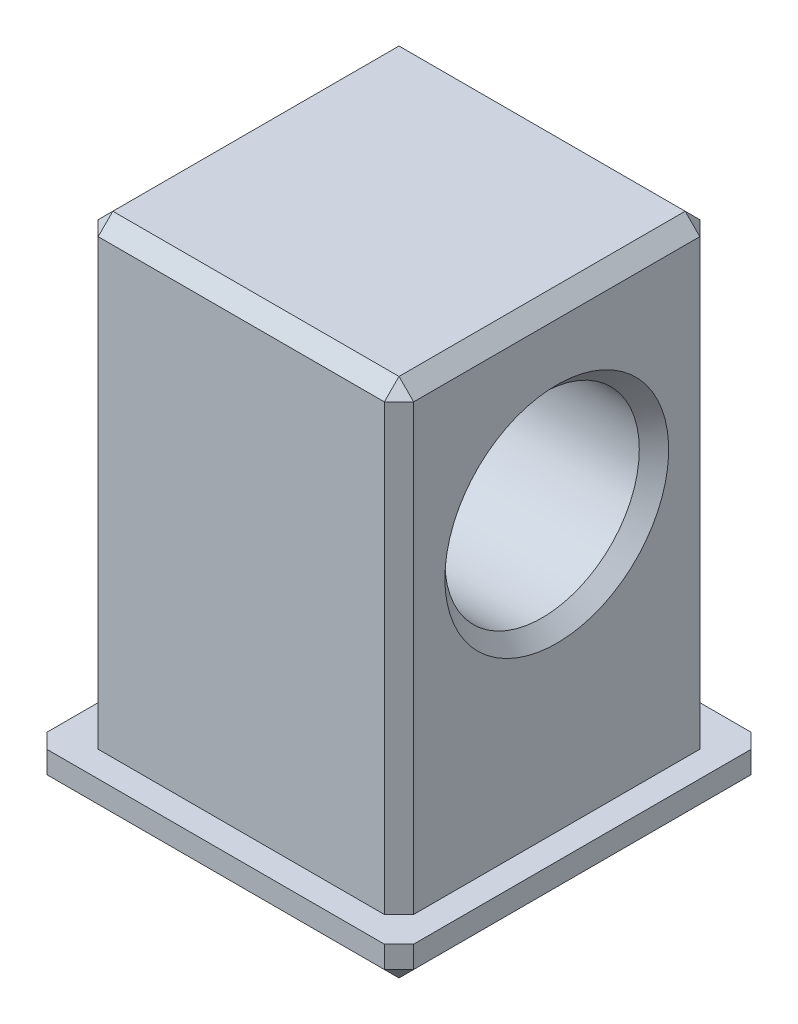
ISO-10303-21;
HEADER;
FILE_DESCRIPTION(('STEP AP214'),'2;1');
FILE_NAME('part.step','',(''),(''),'','','');
FILE_SCHEMA(('AUTOMOTIVE_DESIGN { 1 0 10303 214 1 1 1 1 }'));
ENDSEC;
DATA;
#1=APPLICATION_CONTEXT('core data for automotive mechanical design processes');
#2=APPLICATION_PROTOCOL_DEFINITION('international standard','automotive_design',2000,#1);
#3=PRODUCT_CONTEXT('',#1,'mechanical');
#4=PRODUCT('Part','Part','',(#3));
#5=PRODUCT_RELATED_PRODUCT_CATEGORY('part','',(#4));
#6=PRODUCT_DEFINITION_FORMATION('','',#4);
#7=PRODUCT_DEFINITION_CONTEXT('part definition',#1,'design');
#8=PRODUCT_DEFINITION('design','',#6,#7);
#9=PRODUCT_DEFINITION_SHAPE('','',#8);
#10=(LENGTH_UNIT() NAMED_UNIT(*) SI_UNIT(.MILLI.,.METRE.));
#11=(NAMED_UNIT(*) PLANE_ANGLE_UNIT() SI_UNIT($,.RADIAN.));
#12=(NAMED_UNIT(*) SI_UNIT($,.STERADIAN.) SOLID_ANGLE_UNIT());
#13=UNCERTAINTY_MEASURE_WITH_UNIT(LENGTH_MEASURE(1.E-05),#10,'distance_accuracy_value','');
#14=(GEOMETRIC_REPRESENTATION_CONTEXT(3) GLOBAL_UNCERTAINTY_ASSIGNED_CONTEXT((#13)) GLOBAL_UNIT_ASSIGNED_CONTEXT((#10,
#11,#12)) REPRESENTATION_CONTEXT('',''));
#15=CARTESIAN_POINT('',(0.,0.,0.));
#16=DIRECTION('',(0.,0.,1.));
#17=DIRECTION('',(1.,0.,0.));
#18=AXIS2_PLACEMENT_3D('',#15,#16,#17);
#19=CARTESIAN_POINT('',(0.,2.54,0.));
#20=DIRECTION('',(0.,-1.,0.));
#21=DIRECTION('',(0.,0.,-1.));
#22=AXIS2_PLACEMENT_3D('',#19,#20,#21);
#23=PLANE('',#22);
#24=DIRECTION('',(0.,0.,-1.));
#25=VECTOR('',#24,1.);
#26=CARTESIAN_POINT('',(25.4,2.54,0.));
#27=LINE('',#26,#25);
#28=CARTESIAN_POINT('',(25.4,2.54,-1.01600000000002));
#29=VERTEX_POINT('',#28);
#30=CARTESIAN_POINT('',(25.4,2.54,-24.384));
#31=VERTEX_POINT('',#30);
#32=EDGE_CURVE('E220',#29,#31,#27,.T.);
#33=ORIENTED_EDGE('',*,*,#32,.T.);
#34=DIRECTION('',(0.707106781186545,0.,0.70710678118655));
#35=VECTOR('',#34,1.);
#36=CARTESIAN_POINT('',(24.384,2.54,-25.4));
#37=LINE('',#36,#35);
#38=CARTESIAN_POINT('',(24.384,2.54,-25.4));
#39=VERTEX_POINT('',#38);
#40=EDGE_CURVE('E285',#31,#39,#37,.F.);
#41=ORIENTED_EDGE('',*,*,#40,.T.);
#42=DIRECTION('',(-1.,0.,0.));
#43=VECTOR('',#42,1.);
#44=CARTESIAN_POINT('',(0.,2.54,-25.4));
#45=LINE('',#44,#43);
#46=CARTESIAN_POINT('',(1.01600000000001,2.54,-25.4));
#47=VERTEX_POINT('',#46);
#48=EDGE_CURVE('E223',#39,#47,#45,.T.);
#49=ORIENTED_EDGE('',*,*,#48,.T.);
#50=DIRECTION('',(0.707106781186545,0.,-0.70710678118655));
#51=VECTOR('',#50,1.);
#52=CARTESIAN_POINT('',(0.,2.54,-24.384));
#53=LINE('',#52,#51);
#54=CARTESIAN_POINT('',(0.,2.54,-24.384));
#55=VERTEX_POINT('',#54);
#56=EDGE_CURVE('E281',#47,#55,#53,.F.);
#57=ORIENTED_EDGE('',*,*,#56,.T.);
#58=DIRECTION('',(0.,0.,1.));
#59=VECTOR('',#58,1.);
#60=CARTESIAN_POINT('',(0.,2.54,0.));
#61=LINE('',#60,#59);
#62=CARTESIAN_POINT('',(0.,2.54,-1.01600000000002));
#63=VERTEX_POINT('',#62);
#64=EDGE_CURVE('E214',#55,#63,#61,.T.);
#65=ORIENTED_EDGE('',*,*,#64,.T.);
#66=DIRECTION('',(-0.707106781186545,0.,-0.70710678118655));
#67=VECTOR('',#66,1.);
#68=CARTESIAN_POINT('',(1.01600000000001,2.54,0.));
#69=LINE('',#68,#67);
#70=CARTESIAN_POINT('',(1.01600000000001,2.54,0.));
#71=VERTEX_POINT('',#70);
#72=EDGE_CURVE('E279',#63,#71,#69,.F.);
#73=ORIENTED_EDGE('',*,*,#72,.T.);
#74=DIRECTION('',(1.,0.,0.));
#75=VECTOR('',#74,1.);
#76=CARTESIAN_POINT('',(0.,2.54,0.));
#77=LINE('',#76,#75);
#78=CARTESIAN_POINT('',(24.384,2.54,0.));
#79=VERTEX_POINT('',#78);
#80=EDGE_CURVE('E217',#71,#79,#77,.T.);
#81=ORIENTED_EDGE('',*,*,#80,.T.);
#82=DIRECTION('',(-0.707106781186545,0.,0.70710678118655));
#83=VECTOR('',#82,1.);
#84=CARTESIAN_POINT('',(25.4,2.54,-1.01600000000002));
#85=LINE('',#84,#83);
#86=EDGE_CURVE('E283',#79,#29,#85,.F.);
#87=ORIENTED_EDGE('',*,*,#86,.T.);
#88=EDGE_LOOP('',(#33,#41,#49,#57,#65,#73,#81,#87));
#89=FACE_BOUND('',#88,.T.);
#90=DIRECTION('',(0.,0.,1.));
#91=VECTOR('',#90,1.);
#92=CARTESIAN_POINT('',(1.778,2.54,-1.778));
#93=LINE('',#92,#91);
#94=CARTESIAN_POINT('',(1.778,2.54,-22.606));
#95=VERTEX_POINT('',#94);
#96=CARTESIAN_POINT('',(1.778,2.54,-2.794));
#97=VERTEX_POINT('',#96);
#98=EDGE_CURVE('E191',#95,#97,#93,.T.);
#99=ORIENTED_EDGE('',*,*,#98,.F.);
#100=DIRECTION('',(-0.707106781186545,0.,0.70710678118655));
#101=VECTOR('',#100,1.);
#102=CARTESIAN_POINT('',(-10.414,2.54,-10.4139999999999));
#103=LINE('',#102,#101);
#104=CARTESIAN_POINT('',(2.79399999999999,2.54,-23.622));
#105=VERTEX_POINT('',#104);
#106=EDGE_CURVE('E176',#95,#105,#103,.F.);
#107=ORIENTED_EDGE('',*,*,#106,.T.);
#108=DIRECTION('',(-1.,0.,0.));
#109=VECTOR('',#108,1.);
#110=CARTESIAN_POINT('',(1.778,2.54,-23.622));
#111=LINE('',#110,#109);
#112=CARTESIAN_POINT('',(22.606,2.54,-23.622));
#113=VERTEX_POINT('',#112);
#114=EDGE_CURVE('E212',#113,#105,#111,.T.);
#115=ORIENTED_EDGE('',*,*,#114,.F.);
#116=DIRECTION('',(-0.707106781186544,0.,-0.707106781186551));
#117=VECTOR('',#116,1.);
#118=CARTESIAN_POINT('',(23.1140000000001,2.54,-23.1139999999999));
#119=LINE('',#118,#117);
#120=CARTESIAN_POINT('',(23.622,2.54,-22.606));
#121=VERTEX_POINT('',#120);
#122=EDGE_CURVE('E11',#113,#121,#119,.F.);
#123=ORIENTED_EDGE('',*,*,#122,.T.);
#124=DIRECTION('',(0.,0.,-1.));
#125=VECTOR('',#124,1.);
#126=CARTESIAN_POINT('',(23.622,2.54,-1.778));
#127=LINE('',#126,#125);
#128=CARTESIAN_POINT('',(23.622,2.54,-2.794));
#129=VERTEX_POINT('',#128);
#130=EDGE_CURVE('E204',#129,#121,#127,.T.);
#131=ORIENTED_EDGE('',*,*,#130,.F.);
#132=DIRECTION('',(0.707106781186545,0.,-0.70710678118655));
#133=VECTOR('',#132,1.);
#134=CARTESIAN_POINT('',(10.4140000000001,2.54,10.414));
#135=LINE('',#134,#133);
#136=CARTESIAN_POINT('',(22.606,2.54,-1.778));
#137=VERTEX_POINT('',#136);
#138=EDGE_CURVE('E48',#129,#137,#135,.F.);
#139=ORIENTED_EDGE('',*,*,#138,.T.);
#140=DIRECTION('',(1.,0.,0.));
#141=VECTOR('',#140,1.);
#142=CARTESIAN_POINT('',(1.778,2.54,-1.778));
#143=LINE('',#142,#141);
#144=CARTESIAN_POINT('',(2.79399999999999,2.54,-1.778));
#145=VERTEX_POINT('',#144);
#146=EDGE_CURVE('E200',#145,#137,#143,.T.);
#147=ORIENTED_EDGE('',*,*,#146,.F.);
#148=DIRECTION('',(0.707106781186545,0.,0.70710678118655));
#149=VECTOR('',#148,1.);
#150=CARTESIAN_POINT('',(2.286,2.54,-2.28599999999999));
#151=LINE('',#150,#149);
#152=EDGE_CURVE('E186',#145,#97,#151,.F.);
#153=ORIENTED_EDGE('',*,*,#152,.T.);
#154=EDGE_LOOP('',(#99,#107,#115,#123,#131,#139,#147,#153));
#155=FACE_BOUND('',#154,.T.);
#156=ADVANCED_FACE('F38',(#89,#155),#23,.F.);
#157=CARTESIAN_POINT('',(0.,2.54,0.));
#158=DIRECTION('',(1.,0.,0.));
#159=DIRECTION('',(0.,0.,-1.));
#160=AXIS2_PLACEMENT_3D('',#157,#158,#159);
#161=PLANE('',#160);
#162=ORIENTED_EDGE('',*,*,#64,.F.);
#163=DIRECTION('',(0.,-1.,0.));
#164=VECTOR('',#163,1.);
#165=CARTESIAN_POINT('',(0.,2.54,-24.384));
#166=LINE('',#165,#164);
#167=CARTESIAN_POINT('',(0.,1.01600000000002,-24.384));
#168=VERTEX_POINT('',#167);
#169=EDGE_CURVE('E56',#55,#168,#166,.T.);
#170=ORIENTED_EDGE('',*,*,#169,.T.);
#171=DIRECTION('',(0.,0.,1.));
#172=VECTOR('',#171,1.);
#173=CARTESIAN_POINT('',(0.,1.01600000000002,0.));
#174=LINE('',#173,#172);
#175=CARTESIAN_POINT('',(0.,1.01600000000002,-1.01600000000002));
#176=VERTEX_POINT('',#175);
#177=EDGE_CURVE('E60',#168,#176,#174,.T.);
#178=ORIENTED_EDGE('',*,*,#177,.T.);
#179=DIRECTION('',(0.,1.,0.));
#180=VECTOR('',#179,1.);
#181=CARTESIAN_POINT('',(0.,2.54,-1.01600000000002));
#182=LINE('',#181,#180);
#183=EDGE_CURVE('E302',#176,#63,#182,.T.);
#184=ORIENTED_EDGE('',*,*,#183,.T.);
#185=EDGE_LOOP('',(#162,#170,#178,#184));
#186=FACE_BOUND('',#185,.T.);
#187=ADVANCED_FACE('F379',(#186),#161,.F.);
#188=CARTESIAN_POINT('',(0.,2.54,0.));
#189=DIRECTION('',(0.,0.,-1.));
#190=DIRECTION('',(-1.,0.,0.));
#191=AXIS2_PLACEMENT_3D('',#188,#189,#190);
#192=PLANE('',#191);
#193=DIRECTION('',(1.,0.,0.));
#194=VECTOR('',#193,1.);
#195=CARTESIAN_POINT('',(25.4,1.01600000000001,0.));
#196=LINE('',#195,#194);
#197=CARTESIAN_POINT('',(1.01600000000001,1.01600000000001,0.));
#198=VERTEX_POINT('',#197);
#199=CARTESIAN_POINT('',(24.384,1.01600000000001,0.));
#200=VERTEX_POINT('',#199);
#201=EDGE_CURVE('E289',#198,#200,#196,.T.);
#202=ORIENTED_EDGE('',*,*,#201,.T.);
#203=DIRECTION('',(0.,1.,0.));
#204=VECTOR('',#203,1.);
#205=CARTESIAN_POINT('',(24.384,2.54,0.));
#206=LINE('',#205,#204);
#207=EDGE_CURVE('E291',#200,#79,#206,.T.);
#208=ORIENTED_EDGE('',*,*,#207,.T.);
#209=ORIENTED_EDGE('',*,*,#80,.F.);
#210=DIRECTION('',(0.,-1.,0.));
#211=VECTOR('',#210,1.);
#212=CARTESIAN_POINT('',(1.01600000000001,2.54,0.));
#213=LINE('',#212,#211);
#214=EDGE_CURVE('E287',#71,#198,#213,.T.);
#215=ORIENTED_EDGE('',*,*,#214,.T.);
#216=EDGE_LOOP('',(#202,#208,#209,#215));
#217=FACE_BOUND('',#216,.T.);
#218=ADVANCED_FACE('F420',(#217),#192,.F.);
#219=CARTESIAN_POINT('',(25.4,2.54,0.));
#220=DIRECTION('',(-1.,0.,0.));
#221=DIRECTION('',(0.,0.,1.));
#222=AXIS2_PLACEMENT_3D('',#219,#220,#221);
#223=PLANE('',#222);
#224=DIRECTION('',(0.,0.,-1.));
#225=VECTOR('',#224,1.);
#226=CARTESIAN_POINT('',(25.4,1.01600000000001,-25.4));
#227=LINE('',#226,#225);
#228=CARTESIAN_POINT('',(25.4,1.01600000000001,-1.01600000000002));
#229=VERTEX_POINT('',#228);
#230=CARTESIAN_POINT('',(25.4,1.01600000000001,-24.384));
#231=VERTEX_POINT('',#230);
#232=EDGE_CURVE('E273',#229,#231,#227,.T.);
#233=ORIENTED_EDGE('',*,*,#232,.T.);
#234=DIRECTION('',(0.,1.,0.));
#235=VECTOR('',#234,1.);
#236=CARTESIAN_POINT('',(25.4,2.54,-24.384));
#237=LINE('',#236,#235);
#238=EDGE_CURVE('E277',#231,#31,#237,.T.);
#239=ORIENTED_EDGE('',*,*,#238,.T.);
#240=ORIENTED_EDGE('',*,*,#32,.F.);
#241=DIRECTION('',(0.,-1.,0.));
#242=VECTOR('',#241,1.);
#243=CARTESIAN_POINT('',(25.4,2.54,-1.01600000000002));
#244=LINE('',#243,#242);
#245=EDGE_CURVE('E275',#29,#229,#244,.T.);
#246=ORIENTED_EDGE('',*,*,#245,.T.);
#247=EDGE_LOOP('',(#233,#239,#240,#246));
#248=FACE_BOUND('',#247,.T.);
#249=ADVANCED_FACE('F412',(#248),#223,.F.);
#250=CARTESIAN_POINT('',(0.,2.54,-25.4));
#251=DIRECTION('',(0.,0.,1.));
#252=DIRECTION('',(1.,0.,0.));
#253=AXIS2_PLACEMENT_3D('',#250,#251,#252);
#254=PLANE('',#253);
#255=ORIENTED_EDGE('',*,*,#48,.F.);
#256=DIRECTION('',(0.,-1.,0.));
#257=VECTOR('',#256,1.);
#258=CARTESIAN_POINT('',(24.384,2.54,-25.4));
#259=LINE('',#258,#257);
#260=CARTESIAN_POINT('',(24.384,1.01600000000001,-25.4));
#261=VERTEX_POINT('',#260);
#262=EDGE_CURVE('E270',#39,#261,#259,.T.);
#263=ORIENTED_EDGE('',*,*,#262,.T.);
#264=DIRECTION('',(-1.,0.,0.));
#265=VECTOR('',#264,1.);
#266=CARTESIAN_POINT('',(0.,1.01600000000001,-25.4));
#267=LINE('',#266,#265);
#268=CARTESIAN_POINT('',(1.01600000000001,1.01600000000001,-25.4));
#269=VERTEX_POINT('',#268);
#270=EDGE_CURVE('E266',#261,#269,#267,.T.);
#271=ORIENTED_EDGE('',*,*,#270,.T.);
#272=DIRECTION('',(0.,1.,0.));
#273=VECTOR('',#272,1.);
#274=CARTESIAN_POINT('',(1.01600000000001,2.54,-25.4));
#275=LINE('',#274,#273);
#276=EDGE_CURVE('E268',#269,#47,#275,.T.);
#277=ORIENTED_EDGE('',*,*,#276,.T.);
#278=EDGE_LOOP('',(#255,#263,#271,#277));
#279=FACE_BOUND('',#278,.T.);
#280=ADVANCED_FACE('F427',(#279),#254,.F.);
#281=CARTESIAN_POINT('',(0.,0.,0.));
#282=DIRECTION('',(0.,-1.,0.));
#283=DIRECTION('',(0.,0.,-1.));
#284=AXIS2_PLACEMENT_3D('',#281,#282,#283);
#285=PLANE('',#284);
#286=DIRECTION('',(0.,0.,1.));
#287=VECTOR('',#286,1.);
#288=CARTESIAN_POINT('',(24.384,0.,0.));
#289=LINE('',#288,#287);
#290=CARTESIAN_POINT('',(24.384,0.,-24.384));
#291=VERTEX_POINT('',#290);
#292=CARTESIAN_POINT('',(24.384,0.,-1.01600000000002));
#293=VERTEX_POINT('',#292);
#294=EDGE_CURVE('E297',#291,#293,#289,.T.);
#295=ORIENTED_EDGE('',*,*,#294,.T.);
#296=DIRECTION('',(-1.,0.,0.));
#297=VECTOR('',#296,1.);
#298=CARTESIAN_POINT('',(0.,0.,-1.01600000000002));
#299=LINE('',#298,#297);
#300=CARTESIAN_POINT('',(1.01600000000001,0.,-1.01600000000002));
#301=VERTEX_POINT('',#300);
#302=EDGE_CURVE('E299',#293,#301,#299,.T.);
#303=ORIENTED_EDGE('',*,*,#302,.T.);
#304=DIRECTION('',(0.,0.,-1.));
#305=VECTOR('',#304,1.);
#306=CARTESIAN_POINT('',(1.01600000000001,0.,-25.4));
#307=LINE('',#306,#305);
#308=CARTESIAN_POINT('',(1.01600000000001,0.,-24.384));
#309=VERTEX_POINT('',#308);
#310=EDGE_CURVE('E293',#301,#309,#307,.T.);
#311=ORIENTED_EDGE('',*,*,#310,.T.);
#312=DIRECTION('',(1.,0.,0.));
#313=VECTOR('',#312,1.);
#314=CARTESIAN_POINT('',(25.4,0.,-24.384));
#315=LINE('',#314,#313);
#316=EDGE_CURVE('E295',#309,#291,#315,.T.);
#317=ORIENTED_EDGE('',*,*,#316,.T.);
#318=EDGE_LOOP('',(#295,#303,#311,#317));
#319=FACE_BOUND('',#318,.T.);
#320=ADVANCED_FACE('F395',(#319),#285,.T.);
#321=CARTESIAN_POINT('',(1.778,34.29,-1.778));
#322=DIRECTION('',(1.,0.,0.));
#323=DIRECTION('',(0.,0.,-1.));
#324=AXIS2_PLACEMENT_3D('',#321,#322,#323);
#325=PLANE('',#324);
#326=CARTESIAN_POINT('',(1.778,21.59,-12.7));
#327=DIRECTION('',(1.,0.,0.));
#328=DIRECTION('',(0.,0.,-1.));
#329=AXIS2_PLACEMENT_3D('',#326,#327,#328);
#330=CIRCLE('',#329,7.74700000000001);
#331=CARTESIAN_POINT('',(1.778,21.59,-20.447));
#332=VERTEX_POINT('',#331);
#333=EDGE_CURVE('E196',#332,#332,#330,.T.);
#334=ORIENTED_EDGE('',*,*,#333,.T.);
#335=EDGE_LOOP('',(#334));
#336=FACE_BOUND('',#335,.T.);
#337=DIRECTION('',(0.,0.,-1.));
#338=VECTOR('',#337,1.);
#339=CARTESIAN_POINT('',(1.778,33.274,-1.778));
#340=LINE('',#339,#338);
#341=CARTESIAN_POINT('',(1.778,33.274,-2.794));
#342=VERTEX_POINT('',#341);
#343=CARTESIAN_POINT('',(1.778,33.274,-22.606));
#344=VERTEX_POINT('',#343);
#345=EDGE_CURVE('E194',#342,#344,#340,.T.);
#346=ORIENTED_EDGE('',*,*,#345,.T.);
#347=DIRECTION('',(0.,-1.,0.));
#348=VECTOR('',#347,1.);
#349=CARTESIAN_POINT('',(1.778,34.29,-22.606));
#350=LINE('',#349,#348);
#351=EDGE_CURVE('E180',#344,#95,#350,.T.);
#352=ORIENTED_EDGE('',*,*,#351,.T.);
#353=ORIENTED_EDGE('',*,*,#98,.T.);
#354=DIRECTION('',(0.,1.,0.));
#355=VECTOR('',#354,1.);
#356=CARTESIAN_POINT('',(1.778,34.29,-2.794));
#357=LINE('',#356,#355);
#358=EDGE_CURVE('E232',#97,#342,#357,.T.);
#359=ORIENTED_EDGE('',*,*,#358,.T.);
#360=EDGE_LOOP('',(#346,#352,#353,#359));
#361=FACE_BOUND('',#360,.T.);
#362=ADVANCED_FACE('F190',(#336,#361),#325,.F.);
#363=CARTESIAN_POINT('',(1.778,34.29,-1.778));
#364=DIRECTION('',(0.,0.,-1.));
#365=DIRECTION('',(-1.,0.,0.));
#366=AXIS2_PLACEMENT_3D('',#363,#364,#365);
#367=PLANE('',#366);
#368=DIRECTION('',(-1.,0.,0.));
#369=VECTOR('',#368,1.);
#370=CARTESIAN_POINT('',(1.778,33.274,-1.778));
#371=LINE('',#370,#369);
#372=CARTESIAN_POINT('',(22.606,33.274,-1.778));
#373=VERTEX_POINT('',#372);
#374=CARTESIAN_POINT('',(2.79399999999999,33.274,-1.778));
#375=VERTEX_POINT('',#374);
#376=EDGE_CURVE('E262',#373,#375,#371,.T.);
#377=ORIENTED_EDGE('',*,*,#376,.T.);
#378=DIRECTION('',(0.,-1.,0.));
#379=VECTOR('',#378,1.);
#380=CARTESIAN_POINT('',(2.79399999999999,34.29,-1.778));
#381=LINE('',#380,#379);
#382=EDGE_CURVE('E264',#375,#145,#381,.T.);
#383=ORIENTED_EDGE('',*,*,#382,.T.);
#384=ORIENTED_EDGE('',*,*,#146,.T.);
#385=DIRECTION('',(0.,1.,0.));
#386=VECTOR('',#385,1.);
#387=CARTESIAN_POINT('',(22.606,34.29,-1.778));
#388=LINE('',#387,#386);
#389=EDGE_CURVE('E260',#137,#373,#388,.T.);
#390=ORIENTED_EDGE('',*,*,#389,.T.);
#391=EDGE_LOOP('',(#377,#383,#384,#390));
#392=FACE_BOUND('',#391,.T.);
#393=ADVANCED_FACE('F689',(#392),#367,.F.);
#394=CARTESIAN_POINT('',(23.622,34.29,-1.778));
#395=DIRECTION('',(-1.,0.,0.));
#396=DIRECTION('',(0.,0.,1.));
#397=AXIS2_PLACEMENT_3D('',#394,#395,#396);
#398=PLANE('',#397);
#399=CARTESIAN_POINT('',(23.622,21.59,-12.7));
#400=DIRECTION('',(-1.,0.,0.));
#401=DIRECTION('',(0.,0.,1.));
#402=AXIS2_PLACEMENT_3D('',#399,#400,#401);
#403=CIRCLE('',#402,7.74700000000001);
#404=CARTESIAN_POINT('',(23.622,21.59,-4.95299999999999));
#405=VERTEX_POINT('',#404);
#406=EDGE_CURVE('E243',#405,#405,#403,.T.);
#407=ORIENTED_EDGE('',*,*,#406,.T.);
#408=EDGE_LOOP('',(#407));
#409=FACE_BOUND('',#408,.T.);
#410=DIRECTION('',(0.,0.,1.));
#411=VECTOR('',#410,1.);
#412=CARTESIAN_POINT('',(23.622,33.274,-1.778));
#413=LINE('',#412,#411);
#414=CARTESIAN_POINT('',(23.622,33.274,-22.606));
#415=VERTEX_POINT('',#414);
#416=CARTESIAN_POINT('',(23.622,33.274,-2.794));
#417=VERTEX_POINT('',#416);
#418=EDGE_CURVE('E239',#415,#417,#413,.T.);
#419=ORIENTED_EDGE('',*,*,#418,.T.);
#420=DIRECTION('',(0.,-1.,0.));
#421=VECTOR('',#420,1.);
#422=CARTESIAN_POINT('',(23.622,34.29,-2.794));
#423=LINE('',#422,#421);
#424=EDGE_CURVE('E241',#417,#129,#423,.T.);
#425=ORIENTED_EDGE('',*,*,#424,.T.);
#426=ORIENTED_EDGE('',*,*,#130,.T.);
#427=DIRECTION('',(0.,1.,0.));
#428=VECTOR('',#427,1.);
#429=CARTESIAN_POINT('',(23.622,34.29,-22.606));
#430=LINE('',#429,#428);
#431=EDGE_CURVE('E237',#121,#415,#430,.T.);
#432=ORIENTED_EDGE('',*,*,#431,.T.);
#433=EDGE_LOOP('',(#419,#425,#426,#432));
#434=FACE_BOUND('',#433,.T.);
#435=ADVANCED_FACE('F681',(#409,#434),#398,.F.);
#436=CARTESIAN_POINT('',(1.778,34.29,-23.622));
#437=DIRECTION('',(0.,0.,1.));
#438=DIRECTION('',(1.,0.,0.));
#439=AXIS2_PLACEMENT_3D('',#436,#437,#438);
#440=PLANE('',#439);
#441=ORIENTED_EDGE('',*,*,#114,.T.);
#442=DIRECTION('',(0.,1.,0.));
#443=VECTOR('',#442,1.);
#444=CARTESIAN_POINT('',(2.79399999999999,34.29,-23.622));
#445=LINE('',#444,#443);
#446=CARTESIAN_POINT('',(2.79399999999999,33.274,-23.622));
#447=VERTEX_POINT('',#446);
#448=EDGE_CURVE('E181',#105,#447,#445,.T.);
#449=ORIENTED_EDGE('',*,*,#448,.T.);
#450=DIRECTION('',(1.,0.,0.));
#451=VECTOR('',#450,1.);
#452=CARTESIAN_POINT('',(1.778,33.274,-23.622));
#453=LINE('',#452,#451);
#454=CARTESIAN_POINT('',(22.606,33.274,-23.622));
#455=VERTEX_POINT('',#454);
#456=EDGE_CURVE('E248',#447,#455,#453,.T.);
#457=ORIENTED_EDGE('',*,*,#456,.T.);
#458=DIRECTION('',(0.,-1.,0.));
#459=VECTOR('',#458,1.);
#460=CARTESIAN_POINT('',(22.606,34.29,-23.622));
#461=LINE('',#460,#459);
#462=EDGE_CURVE('E246',#455,#113,#461,.T.);
#463=ORIENTED_EDGE('',*,*,#462,.T.);
#464=EDGE_LOOP('',(#441,#449,#457,#463));
#465=FACE_BOUND('',#464,.T.);
#466=ADVANCED_FACE('F673',(#465),#440,.F.);
#467=CARTESIAN_POINT('',(0.,34.29,0.));
#468=DIRECTION('',(0.,-1.,0.));
#469=DIRECTION('',(0.,0.,-1.));
#470=AXIS2_PLACEMENT_3D('',#467,#468,#469);
#471=PLANE('',#470);
#472=DIRECTION('',(0.,0.,-1.));
#473=VECTOR('',#472,1.);
#474=CARTESIAN_POINT('',(22.606,34.29,0.));
#475=LINE('',#474,#473);
#476=CARTESIAN_POINT('',(22.606,34.29,-2.794));
#477=VERTEX_POINT('',#476);
#478=CARTESIAN_POINT('',(22.606,34.29,-22.606));
#479=VERTEX_POINT('',#478);
#480=EDGE_CURVE('E251',#477,#479,#475,.T.);
#481=ORIENTED_EDGE('',*,*,#480,.T.);
#482=DIRECTION('',(-1.,0.,0.));
#483=VECTOR('',#482,1.);
#484=CARTESIAN_POINT('',(0.,34.29,-22.606));
#485=LINE('',#484,#483);
#486=CARTESIAN_POINT('',(2.79399999999999,34.29,-22.606));
#487=VERTEX_POINT('',#486);
#488=EDGE_CURVE('E257',#479,#487,#485,.T.);
#489=ORIENTED_EDGE('',*,*,#488,.T.);
#490=DIRECTION('',(0.,0.,1.));
#491=VECTOR('',#490,1.);
#492=CARTESIAN_POINT('',(2.79399999999999,34.29,0.));
#493=LINE('',#492,#491);
#494=CARTESIAN_POINT('',(2.79399999999999,34.29,-2.79399999999999));
#495=VERTEX_POINT('',#494);
#496=EDGE_CURVE('E255',#487,#495,#493,.T.);
#497=ORIENTED_EDGE('',*,*,#496,.T.);
#498=DIRECTION('',(1.,0.,0.));
#499=VECTOR('',#498,1.);
#500=CARTESIAN_POINT('',(0.,34.29,-2.79399999999999));
#501=LINE('',#500,#499);
#502=EDGE_CURVE('E253',#495,#477,#501,.T.);
#503=ORIENTED_EDGE('',*,*,#502,.T.);
#504=EDGE_LOOP('',(#481,#489,#497,#503));
#505=FACE_BOUND('',#504,.T.);
#506=ADVANCED_FACE('F665',(#505),#471,.F.);
#507=CARTESIAN_POINT('',(25.4,21.59,-12.7));
#508=DIRECTION('',(-1.,0.,0.));
#509=DIRECTION('',(0.,0.,1.));
#510=AXIS2_PLACEMENT_3D('',#507,#508,#509);
#511=CYLINDRICAL_SURFACE('',#510,6.731);
#512=CARTESIAN_POINT('',(2.794,21.59,-12.7));
#513=DIRECTION('',(1.,0.,0.));
#514=DIRECTION('',(0.,0.,-1.));
#515=AXIS2_PLACEMENT_3D('',#512,#513,#514);
#516=CIRCLE('',#515,6.731);
#517=CARTESIAN_POINT('',(2.794,21.59,-19.431));
#518=VERTEX_POINT('',#517);
#519=EDGE_CURVE('E229',#518,#518,#516,.F.);
#520=ORIENTED_EDGE('',*,*,#519,.T.);
#521=EDGE_LOOP('',(#520));
#522=FACE_BOUND('',#521,.T.);
#523=CARTESIAN_POINT('',(22.606,21.59,-12.7));
#524=DIRECTION('',(-1.,0.,0.));
#525=DIRECTION('',(0.,0.,1.));
#526=AXIS2_PLACEMENT_3D('',#523,#524,#525);
#527=CIRCLE('',#526,6.731);
#528=CARTESIAN_POINT('',(22.606,21.59,-5.969));
#529=VERTEX_POINT('',#528);
#530=EDGE_CURVE('E226',#529,#529,#527,.F.);
#531=ORIENTED_EDGE('',*,*,#530,.T.);
#532=EDGE_LOOP('',(#531));
#533=FACE_BOUND('',#532,.T.);
#534=ADVANCED_FACE('F467',(#522,#533),#511,.F.);
#535=CARTESIAN_POINT('',(2.794,21.59,-12.7));
#536=DIRECTION('',(-1.,0.,0.));
#537=DIRECTION('',(0.,0.,1.));
#538=AXIS2_PLACEMENT_3D('',#535,#536,#537);
#539=CONICAL_SURFACE('',#538,6.731,0.785398163397448);
#540=ORIENTED_EDGE('',*,*,#333,.F.);
#541=EDGE_LOOP('',(#540));
#542=FACE_BOUND('',#541,.T.);
#543=ORIENTED_EDGE('',*,*,#519,.F.);
#544=EDGE_LOOP('',(#543));
#545=FACE_BOUND('',#544,.T.);
#546=ADVANCED_FACE('F460',(#542,#545),#539,.F.);
#547=CARTESIAN_POINT('',(23.622,21.59,-12.7));
#548=DIRECTION('',(1.,0.,0.));
#549=DIRECTION('',(0.,0.,-1.));
#550=AXIS2_PLACEMENT_3D('',#547,#548,#549);
#551=CONICAL_SURFACE('',#550,7.747,0.785398163397445);
#552=ORIENTED_EDGE('',*,*,#530,.F.);
#553=EDGE_LOOP('',(#552));
#554=FACE_BOUND('',#553,.T.);
#555=ORIENTED_EDGE('',*,*,#406,.F.);
#556=EDGE_LOOP('',(#555));
#557=FACE_BOUND('',#556,.T.);
#558=ADVANCED_FACE('F466',(#554,#557),#551,.F.);
#559=CARTESIAN_POINT('',(23.622,34.29,-2.794));
#560=DIRECTION('',(-0.70710678118655,0.,-0.707106781186545));
#561=DIRECTION('',(0.,-1.,0.));
#562=AXIS2_PLACEMENT_3D('',#559,#560,#561);
#563=PLANE('',#562);
#564=DIRECTION('',(-0.707106781186545,0.,0.70710678118655));
#565=VECTOR('',#564,1.);
#566=CARTESIAN_POINT('',(23.114,33.274,-2.286));
#567=LINE('',#566,#565);
#568=EDGE_CURVE('E201',#373,#417,#567,.F.);
#569=ORIENTED_EDGE('',*,*,#568,.F.);
#570=ORIENTED_EDGE('',*,*,#389,.F.);
#571=ORIENTED_EDGE('',*,*,#138,.F.);
#572=ORIENTED_EDGE('',*,*,#424,.F.);
#573=EDGE_LOOP('',(#569,#570,#571,#572));
#574=FACE_BOUND('',#573,.T.);
#575=ADVANCED_FACE('F474',(#574),#563,.F.);
#576=CARTESIAN_POINT('',(22.606,34.29,-2.794));
#577=DIRECTION('',(0.57735026918963,0.577350269189622,0.577350269189626));
#578=DIRECTION('',(0.707106781186545,0.,-0.70710678118655));
#579=AXIS2_PLACEMENT_3D('',#576,#577,#578);
#580=PLANE('',#579);
#581=DIRECTION('',(0.,0.70710678118655,-0.707106781186545));
#582=VECTOR('',#581,1.);
#583=CARTESIAN_POINT('',(22.606,34.29,-2.794));
#584=LINE('',#583,#582);
#585=EDGE_CURVE('E333',#373,#477,#584,.T.);
#586=ORIENTED_EDGE('',*,*,#585,.F.);
#587=ORIENTED_EDGE('',*,*,#568,.T.);
#588=DIRECTION('',(0.707106781186545,-0.70710678118655,0.));
#589=VECTOR('',#588,1.);
#590=CARTESIAN_POINT('',(22.606,34.29,-2.794));
#591=LINE('',#590,#589);
#592=EDGE_CURVE('E207',#477,#417,#591,.T.);
#593=ORIENTED_EDGE('',*,*,#592,.F.);
#594=EDGE_LOOP('',(#586,#587,#593));
#595=FACE_BOUND('',#594,.T.);
#596=ADVANCED_FACE('F544',(#595),#580,.T.);
#597=CARTESIAN_POINT('',(22.606,34.29,-23.622));
#598=DIRECTION('',(-0.707106781186551,0.,0.707106781186544));
#599=DIRECTION('',(0.,-1.,0.));
#600=AXIS2_PLACEMENT_3D('',#597,#598,#599);
#601=PLANE('',#600);
#602=ORIENTED_EDGE('',*,*,#122,.F.);
#603=ORIENTED_EDGE('',*,*,#462,.F.);
#604=DIRECTION('',(0.707106781186544,0.,0.707106781186551));
#605=VECTOR('',#604,1.);
#606=CARTESIAN_POINT('',(22.606,33.274,-23.622));
#607=LINE('',#606,#605);
#608=EDGE_CURVE('E330',#415,#455,#607,.F.);
#609=ORIENTED_EDGE('',*,*,#608,.F.);
#610=ORIENTED_EDGE('',*,*,#431,.F.);
#611=EDGE_LOOP('',(#602,#603,#609,#610));
#612=FACE_BOUND('',#611,.T.);
#613=ADVANCED_FACE('F537',(#612),#601,.F.);
#614=CARTESIAN_POINT('',(22.606,34.29,0.));
#615=DIRECTION('',(-0.70710678118655,-0.707106781186545,0.));
#616=DIRECTION('',(0.,0.,-1.));
#617=AXIS2_PLACEMENT_3D('',#614,#615,#616);
#618=PLANE('',#617);
#619=ORIENTED_EDGE('',*,*,#592,.T.);
#620=ORIENTED_EDGE('',*,*,#418,.F.);
#621=DIRECTION('',(-0.707106781186545,0.70710678118655,0.));
#622=VECTOR('',#621,1.);
#623=CARTESIAN_POINT('',(23.114,33.782,-22.606));
#624=LINE('',#623,#622);
#625=EDGE_CURVE('E327',#479,#415,#624,.F.);
#626=ORIENTED_EDGE('',*,*,#625,.F.);
#627=ORIENTED_EDGE('',*,*,#480,.F.);
#628=EDGE_LOOP('',(#619,#620,#626,#627));
#629=FACE_BOUND('',#628,.T.);
#630=ADVANCED_FACE('F530',(#629),#618,.F.);
#631=CARTESIAN_POINT('',(0.,34.29,-2.79399999999999));
#632=DIRECTION('',(0.,-0.707106781186545,-0.70710678118655));
#633=DIRECTION('',(1.,0.,0.));
#634=AXIS2_PLACEMENT_3D('',#631,#632,#633);
#635=PLANE('',#634);
#636=ORIENTED_EDGE('',*,*,#585,.T.);
#637=ORIENTED_EDGE('',*,*,#502,.F.);
#638=DIRECTION('',(0.,-0.70710678118655,0.707106781186545));
#639=VECTOR('',#638,1.);
#640=CARTESIAN_POINT('',(2.79399999999999,34.29,-2.79399999999999));
#641=LINE('',#640,#639);
#642=EDGE_CURVE('E324',#375,#495,#641,.F.);
#643=ORIENTED_EDGE('',*,*,#642,.F.);
#644=ORIENTED_EDGE('',*,*,#376,.F.);
#645=EDGE_LOOP('',(#636,#637,#643,#644));
#646=FACE_BOUND('',#645,.T.);
#647=ADVANCED_FACE('F523',(#646),#635,.F.);
#648=CARTESIAN_POINT('',(2.79399999999999,34.29,-1.778));
#649=DIRECTION('',(0.70710678118655,0.,-0.707106781186545));
#650=DIRECTION('',(0.,-1.,0.));
#651=AXIS2_PLACEMENT_3D('',#648,#649,#650);
#652=PLANE('',#651);
#653=ORIENTED_EDGE('',*,*,#152,.F.);
#654=ORIENTED_EDGE('',*,*,#382,.F.);
#655=DIRECTION('',(-0.707106781186545,0.,-0.70710678118655));
#656=VECTOR('',#655,1.);
#657=CARTESIAN_POINT('',(2.28599999999999,33.274,-2.286));
#658=LINE('',#657,#656);
#659=EDGE_CURVE('E321',#342,#375,#658,.F.);
#660=ORIENTED_EDGE('',*,*,#659,.F.);
#661=ORIENTED_EDGE('',*,*,#358,.F.);
#662=EDGE_LOOP('',(#653,#654,#660,#661));
#663=FACE_BOUND('',#662,.T.);
#664=ADVANCED_FACE('F516',(#663),#652,.F.);
#665=CARTESIAN_POINT('',(22.606,33.274,-23.622));
#666=DIRECTION('',(0.577350269189631,0.577350269189625,-0.577350269189621));
#667=DIRECTION('',(-0.707106781186544,0.707106781186551,0.));
#668=AXIS2_PLACEMENT_3D('',#665,#666,#667);
#669=PLANE('',#668);
#670=ORIENTED_EDGE('',*,*,#625,.T.);
#671=ORIENTED_EDGE('',*,*,#608,.T.);
#672=DIRECTION('',(0.,-0.707106781186546,-0.707106781186549));
#673=VECTOR('',#672,1.);
#674=CARTESIAN_POINT('',(22.606,33.274,-23.622));
#675=LINE('',#674,#673);
#676=EDGE_CURVE('E318',#479,#455,#675,.T.);
#677=ORIENTED_EDGE('',*,*,#676,.F.);
#678=EDGE_LOOP('',(#670,#671,#677));
#679=FACE_BOUND('',#678,.T.);
#680=ADVANCED_FACE('F509',(#679),#669,.T.);
#681=CARTESIAN_POINT('',(2.79399999999999,34.29,-2.79399999999999));
#682=DIRECTION('',(-0.57735026918963,0.577350269189622,0.577350269189626));
#683=DIRECTION('',(0.707106781186545,0.,0.70710678118655));
#684=AXIS2_PLACEMENT_3D('',#681,#682,#683);
#685=PLANE('',#684);
#686=ORIENTED_EDGE('',*,*,#659,.T.);
#687=ORIENTED_EDGE('',*,*,#642,.T.);
#688=DIRECTION('',(0.707106781186545,0.70710678118655,0.));
#689=VECTOR('',#688,1.);
#690=CARTESIAN_POINT('',(2.79399999999999,34.29,-2.79399999999999));
#691=LINE('',#690,#689);
#692=EDGE_CURVE('E315',#342,#495,#691,.T.);
#693=ORIENTED_EDGE('',*,*,#692,.F.);
#694=EDGE_LOOP('',(#686,#687,#693));
#695=FACE_BOUND('',#694,.T.);
#696=ADVANCED_FACE('F502',(#695),#685,.T.);
#697=CARTESIAN_POINT('',(0.,34.29,-22.606));
#698=DIRECTION('',(0.,-0.707106781186549,0.707106781186546));
#699=DIRECTION('',(-1.,0.,0.));
#700=AXIS2_PLACEMENT_3D('',#697,#698,#699);
#701=PLANE('',#700);
#702=ORIENTED_EDGE('',*,*,#676,.T.);
#703=ORIENTED_EDGE('',*,*,#456,.F.);
#704=DIRECTION('',(0.,0.707106781186546,0.707106781186549));
#705=VECTOR('',#704,1.);
#706=CARTESIAN_POINT('',(2.79399999999999,33.274,-23.622));
#707=LINE('',#706,#705);
#708=EDGE_CURVE('E312',#487,#447,#707,.F.);
#709=ORIENTED_EDGE('',*,*,#708,.F.);
#710=ORIENTED_EDGE('',*,*,#488,.F.);
#711=EDGE_LOOP('',(#702,#703,#709,#710));
#712=FACE_BOUND('',#711,.T.);
#713=ADVANCED_FACE('F495',(#712),#701,.F.);
#714=CARTESIAN_POINT('',(2.79399999999999,34.29,0.));
#715=DIRECTION('',(0.70710678118655,-0.707106781186545,0.));
#716=DIRECTION('',(0.,0.,1.));
#717=AXIS2_PLACEMENT_3D('',#714,#715,#716);
#718=PLANE('',#717);
#719=ORIENTED_EDGE('',*,*,#692,.T.);
#720=ORIENTED_EDGE('',*,*,#496,.F.);
#721=DIRECTION('',(-0.707106781186545,-0.70710678118655,0.));
#722=VECTOR('',#721,1.);
#723=CARTESIAN_POINT('',(2.286,33.782,-22.606));
#724=LINE('',#723,#722);
#725=EDGE_CURVE('E310',#344,#487,#724,.F.);
#726=ORIENTED_EDGE('',*,*,#725,.F.);
#727=ORIENTED_EDGE('',*,*,#345,.F.);
#728=EDGE_LOOP('',(#719,#720,#726,#727));
#729=FACE_BOUND('',#728,.T.);
#730=ADVANCED_FACE('F488',(#729),#718,.F.);
#731=CARTESIAN_POINT('',(2.79399999999999,33.274,-23.622));
#732=DIRECTION('',(-0.57735026918963,0.577350269189624,-0.577350269189623));
#733=DIRECTION('',(-0.707106781186544,-0.707106781186551,0.));
#734=AXIS2_PLACEMENT_3D('',#731,#732,#733);
#735=PLANE('',#734);
#736=ORIENTED_EDGE('',*,*,#725,.T.);
#737=ORIENTED_EDGE('',*,*,#708,.T.);
#738=DIRECTION('',(0.707106781186545,0.,-0.70710678118655));
#739=VECTOR('',#738,1.);
#740=CARTESIAN_POINT('',(2.79399999999999,33.274,-23.622));
#741=LINE('',#740,#739);
#742=EDGE_CURVE('E308',#344,#447,#741,.T.);
#743=ORIENTED_EDGE('',*,*,#742,.F.);
#744=EDGE_LOOP('',(#736,#737,#743));
#745=FACE_BOUND('',#744,.T.);
#746=ADVANCED_FACE('F482',(#745),#735,.T.);
#747=CARTESIAN_POINT('',(1.778,34.29,-22.606));
#748=DIRECTION('',(0.70710678118655,0.,0.707106781186545));
#749=DIRECTION('',(0.,-1.,0.));
#750=AXIS2_PLACEMENT_3D('',#747,#748,#749);
#751=PLANE('',#750);
#752=ORIENTED_EDGE('',*,*,#742,.T.);
#753=ORIENTED_EDGE('',*,*,#448,.F.);
#754=ORIENTED_EDGE('',*,*,#106,.F.);
#755=ORIENTED_EDGE('',*,*,#351,.F.);
#756=EDGE_LOOP('',(#752,#753,#754,#755));
#757=FACE_BOUND('',#756,.T.);
#758=ADVANCED_FACE('F179',(#757),#751,.F.);
#759=CARTESIAN_POINT('',(1.01600000000001,2.54,0.));
#760=DIRECTION('',(0.70710678118655,0.,-0.707106781186545));
#761=DIRECTION('',(0.,-1.,0.));
#762=AXIS2_PLACEMENT_3D('',#759,#760,#761);
#763=PLANE('',#762);
#764=DIRECTION('',(0.707106781186545,0.,0.70710678118655));
#765=VECTOR('',#764,1.);
#766=CARTESIAN_POINT('',(0.508000000000005,1.01600000000001,-0.508000000000008));
#767=LINE('',#766,#765);
#768=EDGE_CURVE('E43',#198,#176,#767,.F.);
#769=ORIENTED_EDGE('',*,*,#768,.F.);
#770=ORIENTED_EDGE('',*,*,#214,.F.);
#771=ORIENTED_EDGE('',*,*,#72,.F.);
#772=ORIENTED_EDGE('',*,*,#183,.F.);
#773=EDGE_LOOP('',(#769,#770,#771,#772));
#774=FACE_BOUND('',#773,.T.);
#775=ADVANCED_FACE('F41',(#774),#763,.F.);
#776=CARTESIAN_POINT('',(1.01600000000001,0.,-1.01600000000002));
#777=DIRECTION('',(-0.57735026918963,-0.577350269189626,0.577350269189622));
#778=DIRECTION('',(0.707106781186545,-0.70710678118655,0.));
#779=AXIS2_PLACEMENT_3D('',#776,#777,#778);
#780=PLANE('',#779);
#781=DIRECTION('',(0.,0.707106781186545,0.70710678118655));
#782=VECTOR('',#781,1.);
#783=CARTESIAN_POINT('',(1.01600000000001,0.,-1.01600000000002));
#784=LINE('',#783,#782);
#785=EDGE_CURVE('E364',#198,#301,#784,.F.);
#786=ORIENTED_EDGE('',*,*,#785,.F.);
#787=ORIENTED_EDGE('',*,*,#768,.T.);
#788=DIRECTION('',(0.707106781186545,-0.70710678118655,0.));
#789=VECTOR('',#788,1.);
#790=CARTESIAN_POINT('',(1.01600000000001,0.,-1.01600000000002));
#791=LINE('',#790,#789);
#792=EDGE_CURVE('E366',#301,#176,#791,.F.);
#793=ORIENTED_EDGE('',*,*,#792,.F.);
#794=EDGE_LOOP('',(#786,#787,#793));
#795=FACE_BOUND('',#794,.T.);
#796=ADVANCED_FACE('F374',(#795),#780,.T.);
#797=CARTESIAN_POINT('',(0.,2.54,-24.384));
#798=DIRECTION('',(0.70710678118655,0.,0.707106781186545));
#799=DIRECTION('',(0.,-1.,0.));
#800=AXIS2_PLACEMENT_3D('',#797,#798,#799);
#801=PLANE('',#800);
#802=ORIENTED_EDGE('',*,*,#56,.F.);
#803=ORIENTED_EDGE('',*,*,#276,.F.);
#804=DIRECTION('',(-0.707106781186545,0.,0.70710678118655));
#805=VECTOR('',#804,1.);
#806=CARTESIAN_POINT('',(0.,1.01600000000002,-24.384));
#807=LINE('',#806,#805);
#808=EDGE_CURVE('E361',#168,#269,#807,.F.);
#809=ORIENTED_EDGE('',*,*,#808,.F.);
#810=ORIENTED_EDGE('',*,*,#169,.F.);
#811=EDGE_LOOP('',(#802,#803,#809,#810));
#812=FACE_BOUND('',#811,.T.);
#813=ADVANCED_FACE('F386',(#812),#801,.F.);
#814=CARTESIAN_POINT('',(0.,1.01600000000002,0.));
#815=DIRECTION('',(-0.70710678118655,-0.707106781186545,0.));
#816=DIRECTION('',(0.,0.,-1.));
#817=AXIS2_PLACEMENT_3D('',#814,#815,#816);
#818=PLANE('',#817);
#819=ORIENTED_EDGE('',*,*,#792,.T.);
#820=ORIENTED_EDGE('',*,*,#177,.F.);
#821=DIRECTION('',(-0.707106781186545,0.70710678118655,0.));
#822=VECTOR('',#821,1.);
#823=CARTESIAN_POINT('',(0.,1.01600000000002,-24.384));
#824=LINE('',#823,#822);
#825=EDGE_CURVE('E358',#309,#168,#824,.T.);
#826=ORIENTED_EDGE('',*,*,#825,.F.);
#827=ORIENTED_EDGE('',*,*,#310,.F.);
#828=EDGE_LOOP('',(#819,#820,#826,#827));
#829=FACE_BOUND('',#828,.T.);
#830=ADVANCED_FACE('F393',(#829),#818,.T.);
#831=CARTESIAN_POINT('',(0.,1.01600000000001,0.));
#832=DIRECTION('',(0.,-0.70710678118655,0.707106781186545));
#833=DIRECTION('',(-1.,0.,0.));
#834=AXIS2_PLACEMENT_3D('',#831,#832,#833);
#835=PLANE('',#834);
#836=ORIENTED_EDGE('',*,*,#785,.T.);
#837=ORIENTED_EDGE('',*,*,#302,.F.);
#838=DIRECTION('',(0.,-0.707106781186545,-0.70710678118655));
#839=VECTOR('',#838,1.);
#840=CARTESIAN_POINT('',(24.384,0.508000000000005,-0.508000000000008));
#841=LINE('',#840,#839);
#842=EDGE_CURVE('E355',#200,#293,#841,.T.);
#843=ORIENTED_EDGE('',*,*,#842,.F.);
#844=ORIENTED_EDGE('',*,*,#201,.F.);
#845=EDGE_LOOP('',(#836,#837,#843,#844));
#846=FACE_BOUND('',#845,.T.);
#847=ADVANCED_FACE('F400',(#846),#835,.T.);
#848=CARTESIAN_POINT('',(25.4,2.54,-1.01600000000002));
#849=DIRECTION('',(-0.70710678118655,0.,-0.707106781186545));
#850=DIRECTION('',(0.,-1.,0.));
#851=AXIS2_PLACEMENT_3D('',#848,#849,#850);
#852=PLANE('',#851);
#853=ORIENTED_EDGE('',*,*,#86,.F.);
#854=ORIENTED_EDGE('',*,*,#207,.F.);
#855=DIRECTION('',(0.707106781186545,0.,-0.70710678118655));
#856=VECTOR('',#855,1.);
#857=CARTESIAN_POINT('',(25.4,1.01600000000001,-1.01600000000002));
#858=LINE('',#857,#856);
#859=EDGE_CURVE('E352',#229,#200,#858,.F.);
#860=ORIENTED_EDGE('',*,*,#859,.F.);
#861=ORIENTED_EDGE('',*,*,#245,.F.);
#862=EDGE_LOOP('',(#853,#854,#860,#861));
#863=FACE_BOUND('',#862,.T.);
#864=ADVANCED_FACE('F418',(#863),#852,.F.);
#865=CARTESIAN_POINT('',(0.,1.01600000000002,-24.384));
#866=DIRECTION('',(-0.57735026918963,-0.577350269189626,-0.577350269189622));
#867=DIRECTION('',(0.707106781186545,-0.70710678118655,0.));
#868=AXIS2_PLACEMENT_3D('',#865,#866,#867);
#869=PLANE('',#868);
#870=ORIENTED_EDGE('',*,*,#825,.T.);
#871=ORIENTED_EDGE('',*,*,#808,.T.);
#872=DIRECTION('',(0.,-0.707106781186545,0.70710678118655));
#873=VECTOR('',#872,1.);
#874=CARTESIAN_POINT('',(1.01600000000001,0.508000000000005,-24.892));
#875=LINE('',#874,#873);
#876=EDGE_CURVE('E349',#309,#269,#875,.F.);
#877=ORIENTED_EDGE('',*,*,#876,.F.);
#878=EDGE_LOOP('',(#870,#871,#877));
#879=FACE_BOUND('',#878,.T.);
#880=ADVANCED_FACE('F391',(#879),#869,.T.);
#881=CARTESIAN_POINT('',(25.4,1.01600000000001,-1.01600000000002));
#882=DIRECTION('',(0.577350269189626,-0.57735026918963,0.577350269189622));
#883=DIRECTION('',(0.70710678118655,0.707106781186545,0.));
#884=AXIS2_PLACEMENT_3D('',#881,#882,#883);
#885=PLANE('',#884);
#886=ORIENTED_EDGE('',*,*,#859,.T.);
#887=ORIENTED_EDGE('',*,*,#842,.T.);
#888=DIRECTION('',(0.70710678118655,0.707106781186545,0.));
#889=VECTOR('',#888,1.);
#890=CARTESIAN_POINT('',(25.4,1.01600000000001,-1.01600000000002));
#891=LINE('',#890,#889);
#892=EDGE_CURVE('E346',#229,#293,#891,.F.);
#893=ORIENTED_EDGE('',*,*,#892,.F.);
#894=EDGE_LOOP('',(#886,#887,#893));
#895=FACE_BOUND('',#894,.T.);
#896=ADVANCED_FACE('F403',(#895),#885,.T.);
#897=CARTESIAN_POINT('',(0.,1.01600000000001,-25.4));
#898=DIRECTION('',(0.,-0.70710678118655,-0.707106781186545));
#899=DIRECTION('',(1.,0.,0.));
#900=AXIS2_PLACEMENT_3D('',#897,#898,#899);
#901=PLANE('',#900);
#902=ORIENTED_EDGE('',*,*,#876,.T.);
#903=ORIENTED_EDGE('',*,*,#270,.F.);
#904=DIRECTION('',(0.,0.707106781186545,-0.70710678118655));
#905=VECTOR('',#904,1.);
#906=CARTESIAN_POINT('',(24.384,1.01600000000001,-25.4));
#907=LINE('',#906,#905);
#908=EDGE_CURVE('E343',#291,#261,#907,.T.);
#909=ORIENTED_EDGE('',*,*,#908,.F.);
#910=ORIENTED_EDGE('',*,*,#316,.F.);
#911=EDGE_LOOP('',(#902,#903,#909,#910));
#912=FACE_BOUND('',#911,.T.);
#913=ADVANCED_FACE('F430',(#912),#901,.T.);
#914=CARTESIAN_POINT('',(25.4,1.01600000000001,0.));
#915=DIRECTION('',(0.707106781186545,-0.70710678118655,0.));
#916=DIRECTION('',(0.,0.,1.));
#917=AXIS2_PLACEMENT_3D('',#914,#915,#916);
#918=PLANE('',#917);
#919=ORIENTED_EDGE('',*,*,#892,.T.);
#920=ORIENTED_EDGE('',*,*,#294,.F.);
#921=DIRECTION('',(-0.70710678118655,-0.707106781186545,0.));
#922=VECTOR('',#921,1.);
#923=CARTESIAN_POINT('',(24.892,0.508000000000005,-24.384));
#924=LINE('',#923,#922);
#925=EDGE_CURVE('E340',#231,#291,#924,.T.);
#926=ORIENTED_EDGE('',*,*,#925,.F.);
#927=ORIENTED_EDGE('',*,*,#232,.F.);
#928=EDGE_LOOP('',(#919,#920,#926,#927));
#929=FACE_BOUND('',#928,.T.);
#930=ADVANCED_FACE('F407',(#929),#918,.T.);
#931=CARTESIAN_POINT('',(24.384,1.01600000000001,-25.4));
#932=DIRECTION('',(0.577350269189626,-0.57735026918963,-0.577350269189622));
#933=DIRECTION('',(0.70710678118655,0.707106781186545,0.));
#934=AXIS2_PLACEMENT_3D('',#931,#932,#933);
#935=PLANE('',#934);
#936=ORIENTED_EDGE('',*,*,#925,.T.);
#937=ORIENTED_EDGE('',*,*,#908,.T.);
#938=DIRECTION('',(-0.707106781186545,0.,-0.70710678118655));
#939=VECTOR('',#938,1.);
#940=CARTESIAN_POINT('',(24.384,1.01600000000001,-25.4));
#941=LINE('',#940,#939);
#942=EDGE_CURVE('E338',#231,#261,#941,.T.);
#943=ORIENTED_EDGE('',*,*,#942,.F.);
#944=EDGE_LOOP('',(#936,#937,#943));
#945=FACE_BOUND('',#944,.T.);
#946=ADVANCED_FACE('F432',(#945),#935,.T.);
#947=CARTESIAN_POINT('',(24.384,2.54,-25.4));
#948=DIRECTION('',(-0.70710678118655,0.,0.707106781186545));
#949=DIRECTION('',(0.,-1.,0.));
#950=AXIS2_PLACEMENT_3D('',#947,#948,#949);
#951=PLANE('',#950);
#952=ORIENTED_EDGE('',*,*,#40,.F.);
#953=ORIENTED_EDGE('',*,*,#238,.F.);
#954=ORIENTED_EDGE('',*,*,#942,.T.);
#955=ORIENTED_EDGE('',*,*,#262,.F.);
#956=EDGE_LOOP('',(#952,#953,#954,#955));
#957=FACE_BOUND('',#956,.T.);
#958=ADVANCED_FACE('F424',(#957),#951,.F.);
#959=CLOSED_SHELL('',(#156,#187,#218,#249,#280,#320,#362,#393,#435,#466,#506,#534,#546,#558,
#575,#596,#613,#630,#647,#664,#680,#696,#713,#730,#746,#758,#775,#796,#813,#830,#847,#864,#880,
#896,#913,#930,#946,#958));
#960=MANIFOLD_SOLID_BREP('B2',#959);
#961=ADVANCED_BREP_SHAPE_REPRESENTATION('',(#18,#960),#14);
#962=SHAPE_DEFINITION_REPRESENTATION(#9,#961);
ENDSEC;
END-ISO-10303-21;
